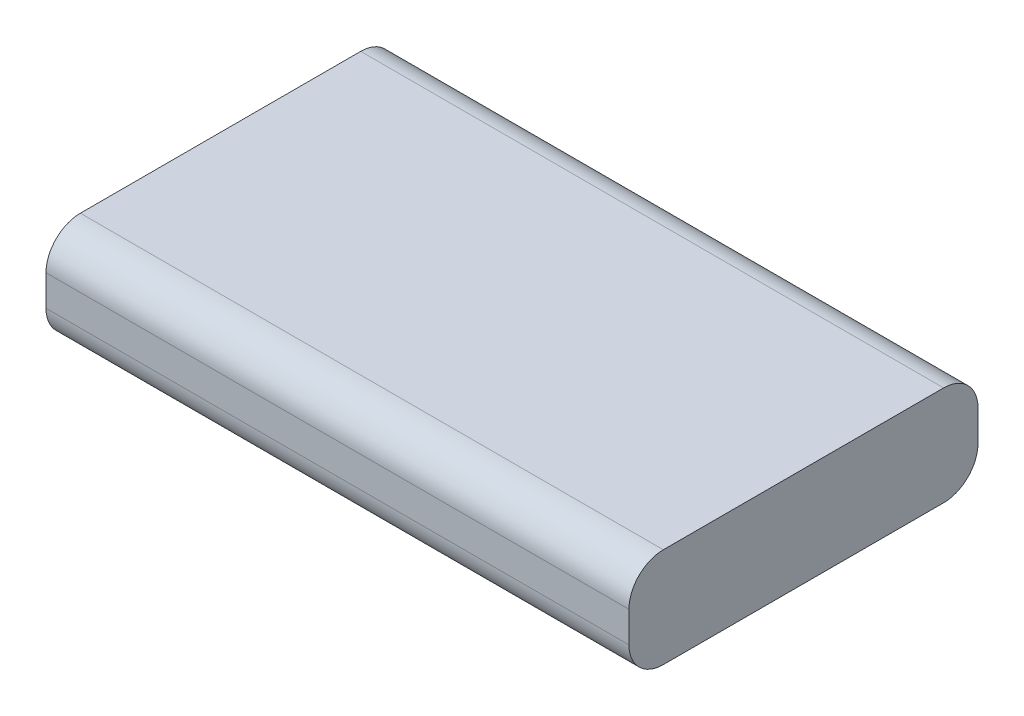
ISO-10303-21;
HEADER;
FILE_DESCRIPTION(('STEP AP214'),'2;1');
FILE_NAME('part.step','',(''),(''),'','','');
FILE_SCHEMA(('AUTOMOTIVE_DESIGN { 1 0 10303 214 1 1 1 1 }'));
ENDSEC;
DATA;
#1=APPLICATION_CONTEXT('core data for automotive mechanical design processes');
#2=APPLICATION_PROTOCOL_DEFINITION('international standard','automotive_design',2000,#1);
#3=PRODUCT_CONTEXT('',#1,'mechanical');
#4=PRODUCT('Part','Part','',(#3));
#5=PRODUCT_RELATED_PRODUCT_CATEGORY('part','',(#4));
#6=PRODUCT_DEFINITION_FORMATION('','',#4);
#7=PRODUCT_DEFINITION_CONTEXT('part definition',#1,'design');
#8=PRODUCT_DEFINITION('design','',#6,#7);
#9=PRODUCT_DEFINITION_SHAPE('','',#8);
#10=(LENGTH_UNIT() NAMED_UNIT(*) SI_UNIT(.MILLI.,.METRE.));
#11=(NAMED_UNIT(*) PLANE_ANGLE_UNIT() SI_UNIT($,.RADIAN.));
#12=(NAMED_UNIT(*) SI_UNIT($,.STERADIAN.) SOLID_ANGLE_UNIT());
#13=UNCERTAINTY_MEASURE_WITH_UNIT(LENGTH_MEASURE(1.E-05),#10,'distance_accuracy_value','');
#14=(GEOMETRIC_REPRESENTATION_CONTEXT(3) GLOBAL_UNCERTAINTY_ASSIGNED_CONTEXT((#13)) GLOBAL_UNIT_ASSIGNED_CONTEXT((#10,
#11,#12)) REPRESENTATION_CONTEXT('',''));
#15=CARTESIAN_POINT('',(0.,0.,0.));
#16=DIRECTION('',(0.,0.,1.));
#17=DIRECTION('',(1.,0.,0.));
#18=AXIS2_PLACEMENT_3D('',#15,#16,#17);
#19=CARTESIAN_POINT('',(0.,14.48,0.));
#20=DIRECTION('',(1.,0.,0.));
#21=DIRECTION('',(0.,0.,-1.));
#22=AXIS2_PLACEMENT_3D('',#19,#20,#21);
#23=PLANE('',#22);
#24=DIRECTION('',(0.,-1.,0.));
#25=VECTOR('',#24,1.);
#26=CARTESIAN_POINT('',(0.,14.48,-50.8));
#27=LINE('',#26,#25);
#28=CARTESIAN_POINT('',(0.,9.48,-50.8));
#29=VERTEX_POINT('',#28);
#30=CARTESIAN_POINT('',(0.,5.,-50.8));
#31=VERTEX_POINT('',#30);
#32=EDGE_CURVE('E114',#29,#31,#27,.T.);
#33=ORIENTED_EDGE('',*,*,#32,.T.);
#34=CARTESIAN_POINT('',(0.,5.,-45.8));
#35=DIRECTION('',(1.,0.,0.));
#36=DIRECTION('',(0.,0.,-1.));
#37=AXIS2_PLACEMENT_3D('',#34,#35,#36);
#38=CIRCLE('',#37,5.);
#39=CARTESIAN_POINT('',(0.,0.,-45.8));
#40=VERTEX_POINT('',#39);
#41=EDGE_CURVE('E122',#31,#40,#38,.F.);
#42=ORIENTED_EDGE('',*,*,#41,.T.);
#43=DIRECTION('',(0.,0.,1.));
#44=VECTOR('',#43,1.);
#45=CARTESIAN_POINT('',(0.,0.,0.));
#46=LINE('',#45,#44);
#47=CARTESIAN_POINT('',(0.,0.,-5.));
#48=VERTEX_POINT('',#47);
#49=EDGE_CURVE('E200',#40,#48,#46,.T.);
#50=ORIENTED_EDGE('',*,*,#49,.T.);
#51=CARTESIAN_POINT('',(0.,5.,-5.));
#52=DIRECTION('',(1.,0.,0.));
#53=DIRECTION('',(0.,0.,-1.));
#54=AXIS2_PLACEMENT_3D('',#51,#52,#53);
#55=CIRCLE('',#54,5.);
#56=CARTESIAN_POINT('',(0.,5.,0.));
#57=VERTEX_POINT('',#56);
#58=EDGE_CURVE('E123',#48,#57,#55,.F.);
#59=ORIENTED_EDGE('',*,*,#58,.T.);
#60=DIRECTION('',(0.,-1.,0.));
#61=VECTOR('',#60,1.);
#62=CARTESIAN_POINT('',(0.,14.48,0.));
#63=LINE('',#62,#61);
#64=CARTESIAN_POINT('',(0.,9.48,0.));
#65=VERTEX_POINT('',#64);
#66=EDGE_CURVE('E141',#65,#57,#63,.T.);
#67=ORIENTED_EDGE('',*,*,#66,.F.);
#68=CARTESIAN_POINT('',(0.,9.48,-5.));
#69=DIRECTION('',(1.,0.,0.));
#70=DIRECTION('',(0.,0.,-1.));
#71=AXIS2_PLACEMENT_3D('',#68,#69,#70);
#72=CIRCLE('',#71,5.);
#73=CARTESIAN_POINT('',(0.,14.48,-5.));
#74=VERTEX_POINT('',#73);
#75=EDGE_CURVE('E145',#65,#74,#72,.F.);
#76=ORIENTED_EDGE('',*,*,#75,.T.);
#77=DIRECTION('',(0.,0.,1.));
#78=VECTOR('',#77,1.);
#79=CARTESIAN_POINT('',(0.,14.48,0.));
#80=LINE('',#79,#78);
#81=CARTESIAN_POINT('',(0.,14.48,-45.8));
#82=VERTEX_POINT('',#81);
#83=EDGE_CURVE('E116',#82,#74,#80,.T.);
#84=ORIENTED_EDGE('',*,*,#83,.F.);
#85=CARTESIAN_POINT('',(0.,9.48,-45.8));
#86=DIRECTION('',(1.,0.,0.));
#87=DIRECTION('',(0.,0.,-1.));
#88=AXIS2_PLACEMENT_3D('',#85,#86,#87);
#89=CIRCLE('',#88,5.);
#90=EDGE_CURVE('E112',#82,#29,#89,.F.);
#91=ORIENTED_EDGE('',*,*,#90,.T.);
#92=EDGE_LOOP('',(#33,#42,#50,#59,#67,#76,#84,#91));
#93=FACE_BOUND('',#92,.T.);
#94=ADVANCED_FACE('F45',(#93),#23,.F.);
#95=CARTESIAN_POINT('',(0.,14.48,0.));
#96=DIRECTION('',(0.,0.,-1.));
#97=DIRECTION('',(-1.,0.,0.));
#98=AXIS2_PLACEMENT_3D('',#95,#96,#97);
#99=PLANE('',#98);
#100=ORIENTED_EDGE('',*,*,#66,.T.);
#101=DIRECTION('',(1.,0.,0.));
#102=VECTOR('',#101,1.);
#103=CARTESIAN_POINT('',(84.84,5.,0.));
#104=LINE('',#103,#102);
#105=CARTESIAN_POINT('',(84.84,5.,0.));
#106=VERTEX_POINT('',#105);
#107=EDGE_CURVE('E11',#57,#106,#104,.T.);
#108=ORIENTED_EDGE('',*,*,#107,.T.);
#109=DIRECTION('',(0.,-1.,0.));
#110=VECTOR('',#109,1.);
#111=CARTESIAN_POINT('',(84.84,14.48,0.));
#112=LINE('',#111,#110);
#113=CARTESIAN_POINT('',(84.84,9.48,0.));
#114=VERTEX_POINT('',#113);
#115=EDGE_CURVE('E148',#114,#106,#112,.T.);
#116=ORIENTED_EDGE('',*,*,#115,.F.);
#117=DIRECTION('',(1.,0.,0.));
#118=VECTOR('',#117,1.);
#119=CARTESIAN_POINT('',(0.,9.48,0.));
#120=LINE('',#119,#118);
#121=EDGE_CURVE('E54',#114,#65,#120,.F.);
#122=ORIENTED_EDGE('',*,*,#121,.T.);
#123=EDGE_LOOP('',(#100,#108,#116,#122));
#124=FACE_BOUND('',#123,.T.);
#125=ADVANCED_FACE('F183',(#124),#99,.F.);
#126=CARTESIAN_POINT('',(84.84,14.48,0.));
#127=DIRECTION('',(-1.,0.,0.));
#128=DIRECTION('',(0.,0.,1.));
#129=AXIS2_PLACEMENT_3D('',#126,#127,#128);
#130=PLANE('',#129);
#131=DIRECTION('',(0.,0.,-1.));
#132=VECTOR('',#131,1.);
#133=CARTESIAN_POINT('',(84.84,0.,0.));
#134=LINE('',#133,#132);
#135=CARTESIAN_POINT('',(84.84,0.,-5.));
#136=VERTEX_POINT('',#135);
#137=CARTESIAN_POINT('',(84.84,0.,-45.8));
#138=VERTEX_POINT('',#137);
#139=EDGE_CURVE('E197',#136,#138,#134,.T.);
#140=ORIENTED_EDGE('',*,*,#139,.T.);
#141=CARTESIAN_POINT('',(84.84,5.,-45.8));
#142=DIRECTION('',(-1.,0.,0.));
#143=DIRECTION('',(0.,0.,1.));
#144=AXIS2_PLACEMENT_3D('',#141,#142,#143);
#145=CIRCLE('',#144,5.);
#146=CARTESIAN_POINT('',(84.84,5.,-50.8));
#147=VERTEX_POINT('',#146);
#148=EDGE_CURVE('E170',#138,#147,#145,.F.);
#149=ORIENTED_EDGE('',*,*,#148,.T.);
#150=DIRECTION('',(0.,-1.,0.));
#151=VECTOR('',#150,1.);
#152=CARTESIAN_POINT('',(84.84,14.48,-50.8));
#153=LINE('',#152,#151);
#154=CARTESIAN_POINT('',(84.84,9.48,-50.8));
#155=VERTEX_POINT('',#154);
#156=EDGE_CURVE('E134',#155,#147,#153,.T.);
#157=ORIENTED_EDGE('',*,*,#156,.F.);
#158=CARTESIAN_POINT('',(84.84,9.48,-45.8));
#159=DIRECTION('',(-1.,0.,0.));
#160=DIRECTION('',(0.,0.,1.));
#161=AXIS2_PLACEMENT_3D('',#158,#159,#160);
#162=CIRCLE('',#161,5.);
#163=CARTESIAN_POINT('',(84.84,14.48,-45.8));
#164=VERTEX_POINT('',#163);
#165=EDGE_CURVE('E139',#155,#164,#162,.F.);
#166=ORIENTED_EDGE('',*,*,#165,.T.);
#167=DIRECTION('',(0.,0.,-1.));
#168=VECTOR('',#167,1.);
#169=CARTESIAN_POINT('',(84.84,14.48,0.));
#170=LINE('',#169,#168);
#171=CARTESIAN_POINT('',(84.84,14.48,-5.));
#172=VERTEX_POINT('',#171);
#173=EDGE_CURVE('E135',#172,#164,#170,.T.);
#174=ORIENTED_EDGE('',*,*,#173,.F.);
#175=CARTESIAN_POINT('',(84.84,9.48,-5.));
#176=DIRECTION('',(-1.,0.,0.));
#177=DIRECTION('',(0.,0.,1.));
#178=AXIS2_PLACEMENT_3D('',#175,#176,#177);
#179=CIRCLE('',#178,5.);
#180=EDGE_CURVE('E68',#172,#114,#179,.F.);
#181=ORIENTED_EDGE('',*,*,#180,.T.);
#182=ORIENTED_EDGE('',*,*,#115,.T.);
#183=CARTESIAN_POINT('',(84.84,5.,-5.));
#184=DIRECTION('',(-1.,0.,0.));
#185=DIRECTION('',(0.,0.,1.));
#186=AXIS2_PLACEMENT_3D('',#183,#184,#185);
#187=CIRCLE('',#186,5.);
#188=EDGE_CURVE('E61',#106,#136,#187,.F.);
#189=ORIENTED_EDGE('',*,*,#188,.T.);
#190=EDGE_LOOP('',(#140,#149,#157,#166,#174,#181,#182,#189));
#191=FACE_BOUND('',#190,.T.);
#192=ADVANCED_FACE('F193',(#191),#130,.F.);
#193=CARTESIAN_POINT('',(0.,14.48,-50.8));
#194=DIRECTION('',(0.,0.,1.));
#195=DIRECTION('',(1.,0.,0.));
#196=AXIS2_PLACEMENT_3D('',#193,#194,#195);
#197=PLANE('',#196);
#198=ORIENTED_EDGE('',*,*,#156,.T.);
#199=DIRECTION('',(-1.,0.,0.));
#200=VECTOR('',#199,1.);
#201=CARTESIAN_POINT('',(0.,5.,-50.8));
#202=LINE('',#201,#200);
#203=EDGE_CURVE('E132',#147,#31,#202,.T.);
#204=ORIENTED_EDGE('',*,*,#203,.T.);
#205=ORIENTED_EDGE('',*,*,#32,.F.);
#206=DIRECTION('',(-1.,0.,0.));
#207=VECTOR('',#206,1.);
#208=CARTESIAN_POINT('',(0.,9.48,-50.8));
#209=LINE('',#208,#207);
#210=EDGE_CURVE('E129',#29,#155,#209,.F.);
#211=ORIENTED_EDGE('',*,*,#210,.T.);
#212=EDGE_LOOP('',(#198,#204,#205,#211));
#213=FACE_BOUND('',#212,.T.);
#214=ADVANCED_FACE('F128',(#213),#197,.F.);
#215=CARTESIAN_POINT('',(0.,14.48,0.));
#216=DIRECTION('',(0.,-1.,0.));
#217=DIRECTION('',(0.,0.,-1.));
#218=AXIS2_PLACEMENT_3D('',#215,#216,#217);
#219=PLANE('',#218);
#220=ORIENTED_EDGE('',*,*,#173,.T.);
#221=DIRECTION('',(-1.,0.,0.));
#222=VECTOR('',#221,1.);
#223=CARTESIAN_POINT('',(0.,14.48,-45.8));
#224=LINE('',#223,#222);
#225=EDGE_CURVE('E177',#164,#82,#224,.T.);
#226=ORIENTED_EDGE('',*,*,#225,.T.);
#227=ORIENTED_EDGE('',*,*,#83,.T.);
#228=DIRECTION('',(1.,0.,0.));
#229=VECTOR('',#228,1.);
#230=CARTESIAN_POINT('',(0.,14.48,-5.));
#231=LINE('',#230,#229);
#232=EDGE_CURVE('E173',#74,#172,#231,.T.);
#233=ORIENTED_EDGE('',*,*,#232,.T.);
#234=EDGE_LOOP('',(#220,#226,#227,#233));
#235=FACE_BOUND('',#234,.T.);
#236=ADVANCED_FACE('F191',(#235),#219,.F.);
#237=CARTESIAN_POINT('',(0.,0.,0.));
#238=DIRECTION('',(0.,-1.,0.));
#239=DIRECTION('',(0.,0.,-1.));
#240=AXIS2_PLACEMENT_3D('',#237,#238,#239);
#241=PLANE('',#240);
#242=ORIENTED_EDGE('',*,*,#49,.F.);
#243=DIRECTION('',(-1.,0.,0.));
#244=VECTOR('',#243,1.);
#245=CARTESIAN_POINT('',(84.84,0.,-45.8));
#246=LINE('',#245,#244);
#247=EDGE_CURVE('E161',#40,#138,#246,.F.);
#248=ORIENTED_EDGE('',*,*,#247,.T.);
#249=ORIENTED_EDGE('',*,*,#139,.F.);
#250=DIRECTION('',(1.,0.,0.));
#251=VECTOR('',#250,1.);
#252=CARTESIAN_POINT('',(0.,0.,-5.));
#253=LINE('',#252,#251);
#254=EDGE_CURVE('E158',#136,#48,#253,.F.);
#255=ORIENTED_EDGE('',*,*,#254,.T.);
#256=EDGE_LOOP('',(#242,#248,#249,#255));
#257=FACE_BOUND('',#256,.T.);
#258=ADVANCED_FACE('F211',(#257),#241,.T.);
#259=CARTESIAN_POINT('',(0.,5.,-45.8));
#260=DIRECTION('',(1.,0.,0.));
#261=DIRECTION('',(0.,0.,-1.));
#262=AXIS2_PLACEMENT_3D('',#259,#260,#261);
#263=CYLINDRICAL_SURFACE('',#262,5.);
#264=ORIENTED_EDGE('',*,*,#148,.F.);
#265=ORIENTED_EDGE('',*,*,#247,.F.);
#266=ORIENTED_EDGE('',*,*,#41,.F.);
#267=ORIENTED_EDGE('',*,*,#203,.F.);
#268=EDGE_LOOP('',(#264,#265,#266,#267));
#269=FACE_BOUND('',#268,.T.);
#270=ADVANCED_FACE('F219',(#269),#263,.T.);
#271=CARTESIAN_POINT('',(0.,9.48,-45.8));
#272=DIRECTION('',(-1.,0.,0.));
#273=DIRECTION('',(0.,0.,1.));
#274=AXIS2_PLACEMENT_3D('',#271,#272,#273);
#275=CYLINDRICAL_SURFACE('',#274,5.);
#276=ORIENTED_EDGE('',*,*,#165,.F.);
#277=ORIENTED_EDGE('',*,*,#210,.F.);
#278=ORIENTED_EDGE('',*,*,#90,.F.);
#279=ORIENTED_EDGE('',*,*,#225,.F.);
#280=EDGE_LOOP('',(#276,#277,#278,#279));
#281=FACE_BOUND('',#280,.T.);
#282=ADVANCED_FACE('F138',(#281),#275,.T.);
#283=CARTESIAN_POINT('',(0.,5.,-5.));
#284=DIRECTION('',(-1.,0.,0.));
#285=DIRECTION('',(0.,0.,1.));
#286=AXIS2_PLACEMENT_3D('',#283,#284,#285);
#287=CYLINDRICAL_SURFACE('',#286,5.);
#288=ORIENTED_EDGE('',*,*,#58,.F.);
#289=ORIENTED_EDGE('',*,*,#254,.F.);
#290=ORIENTED_EDGE('',*,*,#188,.F.);
#291=ORIENTED_EDGE('',*,*,#107,.F.);
#292=EDGE_LOOP('',(#288,#289,#290,#291));
#293=FACE_BOUND('',#292,.T.);
#294=ADVANCED_FACE('F213',(#293),#287,.T.);
#295=CARTESIAN_POINT('',(0.,9.48,-5.));
#296=DIRECTION('',(1.,0.,0.));
#297=DIRECTION('',(0.,0.,-1.));
#298=AXIS2_PLACEMENT_3D('',#295,#296,#297);
#299=CYLINDRICAL_SURFACE('',#298,5.);
#300=ORIENTED_EDGE('',*,*,#75,.F.);
#301=ORIENTED_EDGE('',*,*,#121,.F.);
#302=ORIENTED_EDGE('',*,*,#180,.F.);
#303=ORIENTED_EDGE('',*,*,#232,.F.);
#304=EDGE_LOOP('',(#300,#301,#302,#303));
#305=FACE_BOUND('',#304,.T.);
#306=ADVANCED_FACE('F47',(#305),#299,.T.);
#307=CLOSED_SHELL('',(#94,#125,#192,#214,#236,#258,#270,#282,#294,#306));
#308=MANIFOLD_SOLID_BREP('B2',#307);
#309=ADVANCED_BREP_SHAPE_REPRESENTATION('',(#18,#308),#14);
#310=SHAPE_DEFINITION_REPRESENTATION(#9,#309);
ENDSEC;
END-ISO-10303-21;
